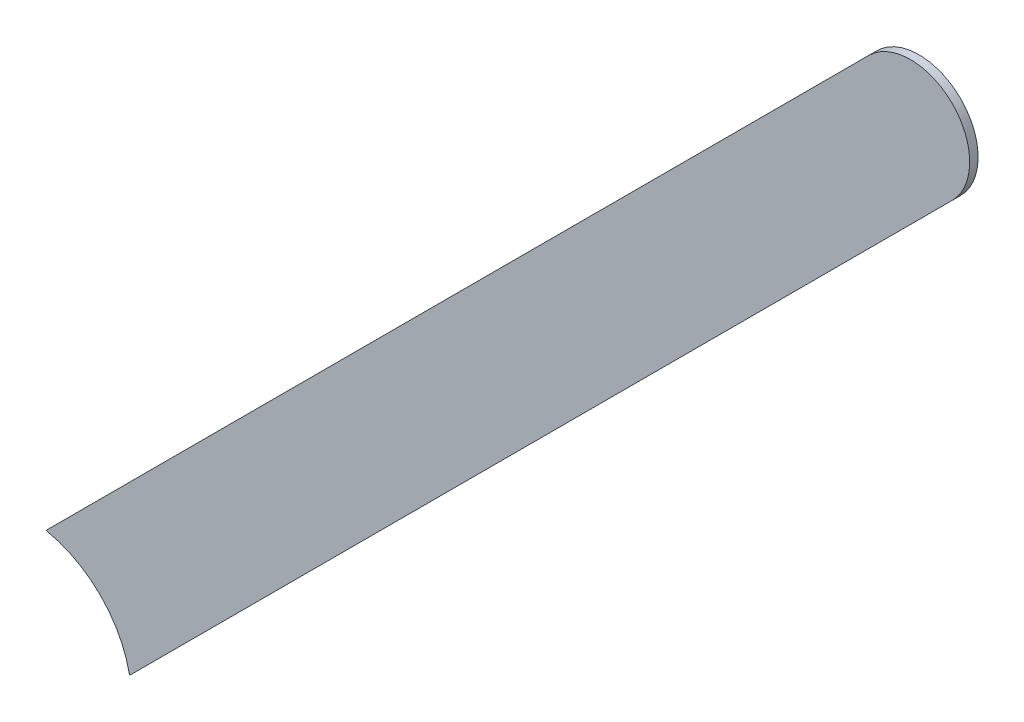
ISO-10303-21;
HEADER;
FILE_DESCRIPTION(('STEP AP214'),'2;1');
FILE_NAME('part.step','',(''),(''),'','','');
FILE_SCHEMA(('AUTOMOTIVE_DESIGN { 1 0 10303 214 1 1 1 1 }'));
ENDSEC;
DATA;
#1=APPLICATION_CONTEXT('core data for automotive mechanical design processes');
#2=APPLICATION_PROTOCOL_DEFINITION('international standard','automotive_design',2000,#1);
#3=PRODUCT_CONTEXT('',#1,'mechanical');
#4=PRODUCT('Part','Part','',(#3));
#5=PRODUCT_RELATED_PRODUCT_CATEGORY('part','',(#4));
#6=PRODUCT_DEFINITION_FORMATION('','',#4);
#7=PRODUCT_DEFINITION_CONTEXT('part definition',#1,'design');
#8=PRODUCT_DEFINITION('design','',#6,#7);
#9=PRODUCT_DEFINITION_SHAPE('','',#8);
#10=(LENGTH_UNIT() NAMED_UNIT(*) SI_UNIT(.MILLI.,.METRE.));
#11=(NAMED_UNIT(*) PLANE_ANGLE_UNIT() SI_UNIT($,.RADIAN.));
#12=(NAMED_UNIT(*) SI_UNIT($,.STERADIAN.) SOLID_ANGLE_UNIT());
#13=UNCERTAINTY_MEASURE_WITH_UNIT(LENGTH_MEASURE(1.E-05),#10,'distance_accuracy_value','');
#14=(GEOMETRIC_REPRESENTATION_CONTEXT(3) GLOBAL_UNCERTAINTY_ASSIGNED_CONTEXT((#13)) GLOBAL_UNIT_ASSIGNED_CONTEXT((#10,
#11,#12)) REPRESENTATION_CONTEXT('',''));
#15=CARTESIAN_POINT('',(0.,0.,0.));
#16=DIRECTION('',(0.,0.,1.));
#17=DIRECTION('',(1.,0.,0.));
#18=AXIS2_PLACEMENT_3D('',#15,#16,#17);
#19=CARTESIAN_POINT('',(34.3413517363948,90.9677993163948,0.));
#20=DIRECTION('',(-0.707106781186548,0.707106781186548,0.));
#21=DIRECTION('',(0.707106781186548,0.707106781186548,0.));
#22=AXIS2_PLACEMENT_3D('',#19,#20,#21);
#23=PLANE('',#22);
#24=DIRECTION('',(0.707106781186548,0.707106781186548,0.));
#25=VECTOR('',#24,1.);
#26=CARTESIAN_POINT('',(34.07677716,90.70322474,0.03556));
#27=LINE('',#26,#25);
#28=CARTESIAN_POINT('',(34.3413517363948,90.9677993163948,0.03556));
#29=VERTEX_POINT('',#28);
#30=CARTESIAN_POINT('',(37.81848926,94.44493684,0.03556));
#31=VERTEX_POINT('',#30);
#32=EDGE_CURVE('E11',#29,#31,#27,.T.);
#33=ORIENTED_EDGE('',*,*,#32,.F.);
#34=DIRECTION('',(0.,0.,1.));
#35=VECTOR('',#34,1.);
#36=CARTESIAN_POINT('',(34.3413517363948,90.9677993163948,0.));
#37=LINE('',#36,#35);
#38=CARTESIAN_POINT('',(34.3413517363948,90.9677993163948,0.));
#39=VERTEX_POINT('',#38);
#40=EDGE_CURVE('E24',#39,#29,#37,.T.);
#41=ORIENTED_EDGE('',*,*,#40,.F.);
#42=DIRECTION('',(0.707106781186548,0.707106781186548,0.));
#43=VECTOR('',#42,1.);
#44=CARTESIAN_POINT('',(34.07677716,90.70322474,0.));
#45=LINE('',#44,#43);
#46=CARTESIAN_POINT('',(37.81848926,94.44493684,0.));
#47=VERTEX_POINT('',#46);
#48=EDGE_CURVE('E75',#39,#47,#45,.T.);
#49=ORIENTED_EDGE('',*,*,#48,.T.);
#50=DIRECTION('',(0.,0.,1.));
#51=VECTOR('',#50,1.);
#52=CARTESIAN_POINT('',(37.81848926,94.44493684,0.));
#53=LINE('',#52,#51);
#54=EDGE_CURVE('E37',#47,#31,#53,.T.);
#55=ORIENTED_EDGE('',*,*,#54,.T.);
#56=EDGE_LOOP('',(#33,#41,#49,#55));
#57=FACE_BOUND('',#56,.T.);
#58=ADVANCED_FACE('F17',(#57),#23,.F.);
#59=CARTESIAN_POINT('',(37.64171288,94.62171322,0.));
#60=DIRECTION('',(0.,0.,-1.));
#61=DIRECTION('',(0.707106781186533,-0.707106781186562,0.));
#62=AXIS2_PLACEMENT_3D('',#59,#60,#61);
#63=CYLINDRICAL_SURFACE('',#62,0.249999554103218);
#64=CARTESIAN_POINT('',(37.64171288,94.62171322,0.03556));
#65=DIRECTION('',(0.,0.,1.));
#66=DIRECTION('',(0.707106781186533,-0.707106781186562,0.));
#67=AXIS2_PLACEMENT_3D('',#64,#65,#66);
#68=CIRCLE('',#67,0.249999554103218);
#69=CARTESIAN_POINT('',(37.4649365,94.7984896,0.03556));
#70=VERTEX_POINT('',#69);
#71=EDGE_CURVE('E83',#31,#70,#68,.T.);
#72=ORIENTED_EDGE('',*,*,#71,.F.);
#73=ORIENTED_EDGE('',*,*,#54,.F.);
#74=CARTESIAN_POINT('',(37.64171288,94.62171322,0.));
#75=DIRECTION('',(0.,0.,1.));
#76=DIRECTION('',(0.707106781186533,-0.707106781186562,0.));
#77=AXIS2_PLACEMENT_3D('',#74,#75,#76);
#78=CIRCLE('',#77,0.249999554103218);
#79=CARTESIAN_POINT('',(37.4649365,94.7984896,0.));
#80=VERTEX_POINT('',#79);
#81=EDGE_CURVE('E81',#47,#80,#78,.T.);
#82=ORIENTED_EDGE('',*,*,#81,.T.);
#83=DIRECTION('',(0.,0.,1.));
#84=VECTOR('',#83,1.);
#85=CARTESIAN_POINT('',(37.4649365,94.7984896,0.));
#86=LINE('',#85,#84);
#87=EDGE_CURVE('E67',#80,#70,#86,.T.);
#88=ORIENTED_EDGE('',*,*,#87,.T.);
#89=EDGE_LOOP('',(#72,#73,#82,#88));
#90=FACE_BOUND('',#89,.T.);
#91=ADVANCED_FACE('F89',(#90),#63,.T.);
#92=CARTESIAN_POINT('',(37.4649365,94.7984896,0.));
#93=DIRECTION('',(0.707106781186548,-0.707106781186548,0.));
#94=DIRECTION('',(-0.707106781186548,-0.707106781186548,0.));
#95=AXIS2_PLACEMENT_3D('',#92,#93,#94);
#96=PLANE('',#95);
#97=DIRECTION('',(-0.707106781186548,-0.707106781186548,0.));
#98=VECTOR('',#97,1.);
#99=CARTESIAN_POINT('',(37.4649365,94.7984896,0.03556));
#100=LINE('',#99,#98);
#101=CARTESIAN_POINT('',(33.9877989763948,91.3213520763948,0.03556));
#102=VERTEX_POINT('',#101);
#103=EDGE_CURVE('E71',#70,#102,#100,.T.);
#104=ORIENTED_EDGE('',*,*,#103,.F.);
#105=ORIENTED_EDGE('',*,*,#87,.F.);
#106=DIRECTION('',(-0.707106781186548,-0.707106781186548,0.));
#107=VECTOR('',#106,1.);
#108=CARTESIAN_POINT('',(37.4649365,94.7984896,0.));
#109=LINE('',#108,#107);
#110=CARTESIAN_POINT('',(33.9877989763948,91.3213520763948,0.));
#111=VERTEX_POINT('',#110);
#112=EDGE_CURVE('E63',#80,#111,#109,.T.);
#113=ORIENTED_EDGE('',*,*,#112,.T.);
#114=DIRECTION('',(0.,0.,1.));
#115=VECTOR('',#114,1.);
#116=CARTESIAN_POINT('',(33.9877989763948,91.3213520763948,0.));
#117=LINE('',#116,#115);
#118=EDGE_CURVE('E53',#111,#102,#117,.T.);
#119=ORIENTED_EDGE('',*,*,#118,.T.);
#120=EDGE_LOOP('',(#104,#105,#113,#119));
#121=FACE_BOUND('',#120,.T.);
#122=ADVANCED_FACE('F66',(#121),#96,.F.);
#123=CARTESIAN_POINT('',(33.90000078,90.88000112,0.));
#124=DIRECTION('',(0.,0.,-1.));
#125=DIRECTION('',(1.,0.,0.));
#126=AXIS2_PLACEMENT_3D('',#123,#124,#125);
#127=CYLINDRICAL_SURFACE('',#126,0.4499991);
#128=ORIENTED_EDGE('',*,*,#40,.T.);
#129=CARTESIAN_POINT('',(33.90000078,90.88000112,0.03556));
#130=DIRECTION('',(0.,0.,1.));
#131=DIRECTION('',(1.,0.,0.));
#132=AXIS2_PLACEMENT_3D('',#129,#130,#131);
#133=CIRCLE('',#132,0.4499991);
#134=EDGE_CURVE('E59',#29,#102,#133,.T.);
#135=ORIENTED_EDGE('',*,*,#134,.T.);
#136=ORIENTED_EDGE('',*,*,#118,.F.);
#137=CARTESIAN_POINT('',(33.90000078,90.88000112,0.));
#138=DIRECTION('',(0.,0.,1.));
#139=DIRECTION('',(1.,0.,0.));
#140=AXIS2_PLACEMENT_3D('',#137,#138,#139);
#141=CIRCLE('',#140,0.4499991);
#142=EDGE_CURVE('E57',#39,#111,#141,.T.);
#143=ORIENTED_EDGE('',*,*,#142,.F.);
#144=EDGE_LOOP('',(#128,#135,#136,#143));
#145=FACE_BOUND('',#144,.T.);
#146=ADVANCED_FACE('F55',(#145),#127,.F.);
#147=CARTESIAN_POINT('',(34.07677716,90.70322474,0.));
#148=DIRECTION('',(0.,0.,-1.));
#149=DIRECTION('',(-1.,0.,0.));
#150=AXIS2_PLACEMENT_3D('',#147,#148,#149);
#151=PLANE('',#150);
#152=ORIENTED_EDGE('',*,*,#48,.F.);
#153=ORIENTED_EDGE('',*,*,#142,.T.);
#154=ORIENTED_EDGE('',*,*,#112,.F.);
#155=ORIENTED_EDGE('',*,*,#81,.F.);
#156=EDGE_LOOP('',(#152,#153,#154,#155));
#157=FACE_BOUND('',#156,.T.);
#158=ADVANCED_FACE('F74',(#157),#151,.T.);
#159=CARTESIAN_POINT('',(34.07677716,90.70322474,0.03556));
#160=DIRECTION('',(0.,0.,-1.));
#161=DIRECTION('',(-1.,0.,0.));
#162=AXIS2_PLACEMENT_3D('',#159,#160,#161);
#163=PLANE('',#162);
#164=ORIENTED_EDGE('',*,*,#134,.F.);
#165=ORIENTED_EDGE('',*,*,#32,.T.);
#166=ORIENTED_EDGE('',*,*,#71,.T.);
#167=ORIENTED_EDGE('',*,*,#103,.T.);
#168=EDGE_LOOP('',(#164,#165,#166,#167));
#169=FACE_BOUND('',#168,.T.);
#170=ADVANCED_FACE('F91',(#169),#163,.F.);
#171=CLOSED_SHELL('',(#58,#91,#122,#146,#158,#170));
#172=MANIFOLD_SOLID_BREP('B1',#171);
#173=ADVANCED_BREP_SHAPE_REPRESENTATION('',(#18,#172),#14);
#174=SHAPE_DEFINITION_REPRESENTATION(#9,#173);
ENDSEC;
END-ISO-10303-21;
